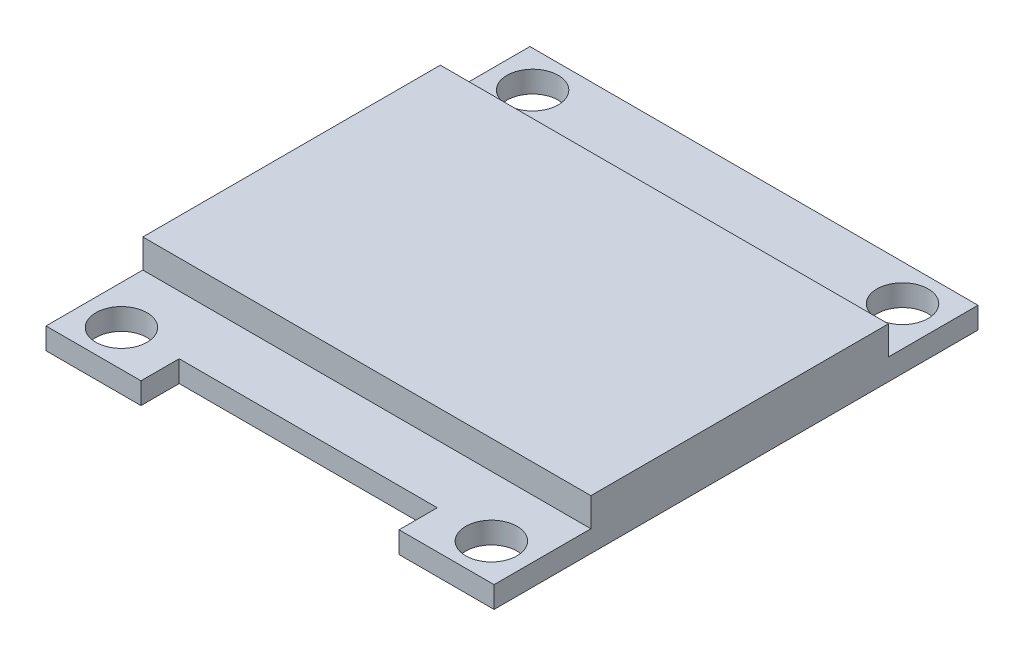
ISO-10303-21;
HEADER;
FILE_DESCRIPTION(('STEP AP214'),'2;1');
FILE_NAME('part.step','',(''),(''),'','','');
FILE_SCHEMA(('AUTOMOTIVE_DESIGN { 1 0 10303 214 1 1 1 1 }'));
ENDSEC;
DATA;
#1=APPLICATION_CONTEXT('core data for automotive mechanical design processes');
#2=APPLICATION_PROTOCOL_DEFINITION('international standard','automotive_design',2000,#1);
#3=PRODUCT_CONTEXT('',#1,'mechanical');
#4=PRODUCT('Part','Part','',(#3));
#5=PRODUCT_RELATED_PRODUCT_CATEGORY('part','',(#4));
#6=PRODUCT_DEFINITION_FORMATION('','',#4);
#7=PRODUCT_DEFINITION_CONTEXT('part definition',#1,'design');
#8=PRODUCT_DEFINITION('design','',#6,#7);
#9=PRODUCT_DEFINITION_SHAPE('','',#8);
#10=(LENGTH_UNIT() NAMED_UNIT(*) SI_UNIT(.MILLI.,.METRE.));
#11=(NAMED_UNIT(*) PLANE_ANGLE_UNIT() SI_UNIT($,.RADIAN.));
#12=(NAMED_UNIT(*) SI_UNIT($,.STERADIAN.) SOLID_ANGLE_UNIT());
#13=UNCERTAINTY_MEASURE_WITH_UNIT(LENGTH_MEASURE(1.E-05),#10,'distance_accuracy_value','');
#14=(GEOMETRIC_REPRESENTATION_CONTEXT(3) GLOBAL_UNCERTAINTY_ASSIGNED_CONTEXT((#13)) GLOBAL_UNIT_ASSIGNED_CONTEXT((#10,
#11,#12)) REPRESENTATION_CONTEXT('',''));
#15=CARTESIAN_POINT('',(0.,0.,0.));
#16=DIRECTION('',(0.,0.,1.));
#17=DIRECTION('',(1.,0.,0.));
#18=AXIS2_PLACEMENT_3D('',#15,#16,#17);
#19=CARTESIAN_POINT('',(-12.5,1.2,13.5));
#20=DIRECTION('',(0.,0.,-1.));
#21=DIRECTION('',(-1.,0.,0.));
#22=AXIS2_PLACEMENT_3D('',#19,#20,#21);
#23=PLANE('',#22);
#24=DIRECTION('',(1.,0.,0.));
#25=VECTOR('',#24,1.);
#26=CARTESIAN_POINT('',(-12.5,1.2,13.5));
#27=LINE('',#26,#25);
#28=CARTESIAN_POINT('',(7.2,1.2,13.5));
#29=VERTEX_POINT('',#28);
#30=CARTESIAN_POINT('',(12.5,1.2,13.5));
#31=VERTEX_POINT('',#30);
#32=EDGE_CURVE('E142',#29,#31,#27,.T.);
#33=ORIENTED_EDGE('',*,*,#32,.F.);
#34=DIRECTION('',(0.,1.,0.));
#35=VECTOR('',#34,1.);
#36=CARTESIAN_POINT('',(7.2,-14.5566788794697,13.5));
#37=LINE('',#36,#35);
#38=CARTESIAN_POINT('',(7.2,0.,13.5));
#39=VERTEX_POINT('',#38);
#40=EDGE_CURVE('E130',#39,#29,#37,.T.);
#41=ORIENTED_EDGE('',*,*,#40,.F.);
#42=DIRECTION('',(1.,0.,0.));
#43=VECTOR('',#42,1.);
#44=CARTESIAN_POINT('',(-12.5,0.,13.5));
#45=LINE('',#44,#43);
#46=CARTESIAN_POINT('',(12.5,0.,13.5));
#47=VERTEX_POINT('',#46);
#48=EDGE_CURVE('E140',#39,#47,#45,.T.);
#49=ORIENTED_EDGE('',*,*,#48,.T.);
#50=DIRECTION('',(0.,-1.,0.));
#51=VECTOR('',#50,1.);
#52=CARTESIAN_POINT('',(12.5,1.2,13.5));
#53=LINE('',#52,#51);
#54=EDGE_CURVE('E159',#31,#47,#53,.T.);
#55=ORIENTED_EDGE('',*,*,#54,.F.);
#56=EDGE_LOOP('',(#33,#41,#49,#55));
#57=FACE_BOUND('',#56,.T.);
#58=ADVANCED_FACE('F37',(#57),#23,.F.);
#59=CARTESIAN_POINT('',(0.,1.2,0.));
#60=DIRECTION('',(0.,-1.,0.));
#61=DIRECTION('',(0.,0.,-1.));
#62=AXIS2_PLACEMENT_3D('',#59,#60,#61);
#63=PLANE('',#62);
#64=CARTESIAN_POINT('',(10.32,1.2,11.47));
#65=DIRECTION('',(0.,1.,0.));
#66=DIRECTION('',(0.,0.,1.));
#67=AXIS2_PLACEMENT_3D('',#64,#65,#66);
#68=CIRCLE('',#67,1.43);
#69=CARTESIAN_POINT('',(10.32,1.2,12.9));
#70=VERTEX_POINT('',#69);
#71=EDGE_CURVE('E232',#70,#70,#68,.T.);
#72=ORIENTED_EDGE('',*,*,#71,.F.);
#73=EDGE_LOOP('',(#72));
#74=FACE_BOUND('',#73,.T.);
#75=CARTESIAN_POINT('',(-10.32,1.2,11.47));
#76=DIRECTION('',(0.,1.,0.));
#77=DIRECTION('',(0.,0.,1.));
#78=AXIS2_PLACEMENT_3D('',#75,#76,#77);
#79=CIRCLE('',#78,1.43);
#80=CARTESIAN_POINT('',(-10.32,1.2,12.9));
#81=VERTEX_POINT('',#80);
#82=EDGE_CURVE('E420',#81,#81,#79,.T.);
#83=ORIENTED_EDGE('',*,*,#82,.F.);
#84=EDGE_LOOP('',(#83));
#85=FACE_BOUND('',#84,.T.);
#86=DIRECTION('',(-1.,0.,0.));
#87=VECTOR('',#86,1.);
#88=CARTESIAN_POINT('',(-7.2,1.2,11.37));
#89=LINE('',#88,#87);
#90=CARTESIAN_POINT('',(7.2,1.2,11.37));
#91=VERTEX_POINT('',#90);
#92=CARTESIAN_POINT('',(-7.2,1.2,11.37));
#93=VERTEX_POINT('',#92);
#94=EDGE_CURVE('E143',#91,#93,#89,.T.);
#95=ORIENTED_EDGE('',*,*,#94,.F.);
#96=DIRECTION('',(0.,0.,-1.));
#97=VECTOR('',#96,1.);
#98=CARTESIAN_POINT('',(7.2,1.2,13.5));
#99=LINE('',#98,#97);
#100=EDGE_CURVE('E216',#29,#91,#99,.T.);
#101=ORIENTED_EDGE('',*,*,#100,.F.);
#102=ORIENTED_EDGE('',*,*,#32,.T.);
#103=DIRECTION('',(0.,0.,-1.));
#104=VECTOR('',#103,1.);
#105=CARTESIAN_POINT('',(12.5,1.2,13.5));
#106=LINE('',#105,#104);
#107=CARTESIAN_POINT('',(12.5,1.2,8.1));
#108=VERTEX_POINT('',#107);
#109=EDGE_CURVE('E204',#31,#108,#106,.T.);
#110=ORIENTED_EDGE('',*,*,#109,.T.);
#111=DIRECTION('',(1.,0.,0.));
#112=VECTOR('',#111,1.);
#113=CARTESIAN_POINT('',(12.5,1.2,8.1));
#114=LINE('',#113,#112);
#115=CARTESIAN_POINT('',(-12.5,1.2,8.1));
#116=VERTEX_POINT('',#115);
#117=EDGE_CURVE('E60',#116,#108,#114,.T.);
#118=ORIENTED_EDGE('',*,*,#117,.F.);
#119=DIRECTION('',(0.,0.,1.));
#120=VECTOR('',#119,1.);
#121=CARTESIAN_POINT('',(-12.5,1.2,13.5));
#122=LINE('',#121,#120);
#123=CARTESIAN_POINT('',(-12.5,1.2,13.5));
#124=VERTEX_POINT('',#123);
#125=EDGE_CURVE('E182',#116,#124,#122,.T.);
#126=ORIENTED_EDGE('',*,*,#125,.T.);
#127=CARTESIAN_POINT('',(-7.2,1.2,13.5));
#128=VERTEX_POINT('',#127);
#129=EDGE_CURVE('E162',#124,#128,#27,.T.);
#130=ORIENTED_EDGE('',*,*,#129,.T.);
#131=DIRECTION('',(0.,0.,1.));
#132=VECTOR('',#131,1.);
#133=CARTESIAN_POINT('',(-7.2,1.2,13.5));
#134=LINE('',#133,#132);
#135=EDGE_CURVE('E219',#93,#128,#134,.T.);
#136=ORIENTED_EDGE('',*,*,#135,.F.);
#137=EDGE_LOOP('',(#95,#101,#102,#110,#118,#126,#130,#136));
#138=FACE_BOUND('',#137,.T.);
#139=ADVANCED_FACE('F215',(#74,#85,#138),#63,.F.);
#140=CARTESIAN_POINT('',(-10.32,1.2,-11.47));
#141=DIRECTION('',(0.,1.,0.));
#142=DIRECTION('',(0.,0.,1.));
#143=AXIS2_PLACEMENT_3D('',#140,#141,#142);
#144=CIRCLE('',#143,1.43);
#145=CARTESIAN_POINT('',(-10.32,1.2,-10.04));
#146=VERTEX_POINT('',#145);
#147=EDGE_CURVE('E427',#146,#146,#144,.T.);
#148=ORIENTED_EDGE('',*,*,#147,.F.);
#149=EDGE_LOOP('',(#148));
#150=FACE_BOUND('',#149,.T.);
#151=CARTESIAN_POINT('',(10.32,1.2,-11.47));
#152=DIRECTION('',(0.,1.,0.));
#153=DIRECTION('',(0.,0.,1.));
#154=AXIS2_PLACEMENT_3D('',#151,#152,#153);
#155=CIRCLE('',#154,1.43);
#156=CARTESIAN_POINT('',(10.32,1.2,-10.04));
#157=VERTEX_POINT('',#156);
#158=EDGE_CURVE('E233',#157,#157,#155,.T.);
#159=ORIENTED_EDGE('',*,*,#158,.F.);
#160=EDGE_LOOP('',(#159));
#161=FACE_BOUND('',#160,.T.);
#162=DIRECTION('',(-1.,0.,0.));
#163=VECTOR('',#162,1.);
#164=CARTESIAN_POINT('',(12.5,1.2,-8.5));
#165=LINE('',#164,#163);
#166=CARTESIAN_POINT('',(12.5,1.2,-8.5));
#167=VERTEX_POINT('',#166);
#168=CARTESIAN_POINT('',(-12.5,1.2,-8.5));
#169=VERTEX_POINT('',#168);
#170=EDGE_CURVE('E240',#167,#169,#165,.T.);
#171=ORIENTED_EDGE('',*,*,#170,.F.);
#172=CARTESIAN_POINT('',(12.5,1.2,-13.5));
#173=VERTEX_POINT('',#172);
#174=EDGE_CURVE('E154',#167,#173,#106,.T.);
#175=ORIENTED_EDGE('',*,*,#174,.T.);
#176=DIRECTION('',(-1.,0.,0.));
#177=VECTOR('',#176,1.);
#178=CARTESIAN_POINT('',(-12.5,1.2,-13.5));
#179=LINE('',#178,#177);
#180=CARTESIAN_POINT('',(-12.5,1.2,-13.5));
#181=VERTEX_POINT('',#180);
#182=EDGE_CURVE('E187',#173,#181,#179,.T.);
#183=ORIENTED_EDGE('',*,*,#182,.T.);
#184=EDGE_CURVE('E172',#181,#169,#122,.T.);
#185=ORIENTED_EDGE('',*,*,#184,.T.);
#186=EDGE_LOOP('',(#171,#175,#183,#185));
#187=FACE_BOUND('',#186,.T.);
#188=ADVANCED_FACE('F257',(#150,#161,#187),#63,.F.);
#189=CARTESIAN_POINT('',(12.5,1.2,13.5));
#190=DIRECTION('',(-1.,0.,0.));
#191=DIRECTION('',(0.,0.,1.));
#192=AXIS2_PLACEMENT_3D('',#189,#190,#191);
#193=PLANE('',#192);
#194=DIRECTION('',(0.,0.,-1.));
#195=VECTOR('',#194,1.);
#196=CARTESIAN_POINT('',(12.5,0.,13.5));
#197=LINE('',#196,#195);
#198=CARTESIAN_POINT('',(12.5,0.,-13.5));
#199=VERTEX_POINT('',#198);
#200=EDGE_CURVE('E149',#47,#199,#197,.T.);
#201=ORIENTED_EDGE('',*,*,#200,.T.);
#202=DIRECTION('',(0.,-1.,0.));
#203=VECTOR('',#202,1.);
#204=CARTESIAN_POINT('',(12.5,1.2,-13.5));
#205=LINE('',#204,#203);
#206=EDGE_CURVE('E11',#173,#199,#205,.T.);
#207=ORIENTED_EDGE('',*,*,#206,.F.);
#208=ORIENTED_EDGE('',*,*,#174,.F.);
#209=DIRECTION('',(0.,-1.,0.));
#210=VECTOR('',#209,1.);
#211=CARTESIAN_POINT('',(12.5,2.8,-8.5));
#212=LINE('',#211,#210);
#213=CARTESIAN_POINT('',(12.5,2.8,-8.5));
#214=VERTEX_POINT('',#213);
#215=EDGE_CURVE('E197',#214,#167,#212,.T.);
#216=ORIENTED_EDGE('',*,*,#215,.F.);
#217=DIRECTION('',(0.,0.,-1.));
#218=VECTOR('',#217,1.);
#219=CARTESIAN_POINT('',(12.5,2.8,-8.5));
#220=LINE('',#219,#218);
#221=CARTESIAN_POINT('',(12.5,2.8,8.1));
#222=VERTEX_POINT('',#221);
#223=EDGE_CURVE('E241',#222,#214,#220,.T.);
#224=ORIENTED_EDGE('',*,*,#223,.F.);
#225=DIRECTION('',(0.,-1.,0.));
#226=VECTOR('',#225,1.);
#227=CARTESIAN_POINT('',(12.5,2.8,8.1));
#228=LINE('',#227,#226);
#229=EDGE_CURVE('E195',#222,#108,#228,.T.);
#230=ORIENTED_EDGE('',*,*,#229,.T.);
#231=ORIENTED_EDGE('',*,*,#109,.F.);
#232=ORIENTED_EDGE('',*,*,#54,.T.);
#233=EDGE_LOOP('',(#201,#207,#208,#216,#224,#230,#231,#232));
#234=FACE_BOUND('',#233,.T.);
#235=ADVANCED_FACE('F39',(#234),#193,.F.);
#236=CARTESIAN_POINT('',(-12.5,1.2,-13.5));
#237=DIRECTION('',(0.,0.,1.));
#238=DIRECTION('',(1.,0.,0.));
#239=AXIS2_PLACEMENT_3D('',#236,#237,#238);
#240=PLANE('',#239);
#241=DIRECTION('',(-1.,0.,0.));
#242=VECTOR('',#241,1.);
#243=CARTESIAN_POINT('',(-12.5,0.,-13.5));
#244=LINE('',#243,#242);
#245=CARTESIAN_POINT('',(-12.5,0.,-13.5));
#246=VERTEX_POINT('',#245);
#247=EDGE_CURVE('E155',#199,#246,#244,.T.);
#248=ORIENTED_EDGE('',*,*,#247,.T.);
#249=DIRECTION('',(0.,-1.,0.));
#250=VECTOR('',#249,1.);
#251=CARTESIAN_POINT('',(-12.5,1.2,-13.5));
#252=LINE('',#251,#250);
#253=EDGE_CURVE('E45',#181,#246,#252,.T.);
#254=ORIENTED_EDGE('',*,*,#253,.F.);
#255=ORIENTED_EDGE('',*,*,#182,.F.);
#256=ORIENTED_EDGE('',*,*,#206,.T.);
#257=EDGE_LOOP('',(#248,#254,#255,#256));
#258=FACE_BOUND('',#257,.T.);
#259=ADVANCED_FACE('F208',(#258),#240,.F.);
#260=CARTESIAN_POINT('',(-12.5,1.2,13.5));
#261=DIRECTION('',(1.,0.,0.));
#262=DIRECTION('',(0.,0.,-1.));
#263=AXIS2_PLACEMENT_3D('',#260,#261,#262);
#264=PLANE('',#263);
#265=DIRECTION('',(0.,0.,1.));
#266=VECTOR('',#265,1.);
#267=CARTESIAN_POINT('',(-12.5,0.,13.5));
#268=LINE('',#267,#266);
#269=CARTESIAN_POINT('',(-12.5,0.,13.5));
#270=VERTEX_POINT('',#269);
#271=EDGE_CURVE('E151',#246,#270,#268,.T.);
#272=ORIENTED_EDGE('',*,*,#271,.T.);
#273=DIRECTION('',(0.,-1.,0.));
#274=VECTOR('',#273,1.);
#275=CARTESIAN_POINT('',(-12.5,1.2,13.5));
#276=LINE('',#275,#274);
#277=EDGE_CURVE('E161',#124,#270,#276,.T.);
#278=ORIENTED_EDGE('',*,*,#277,.F.);
#279=ORIENTED_EDGE('',*,*,#125,.F.);
#280=DIRECTION('',(0.,-1.,0.));
#281=VECTOR('',#280,1.);
#282=CARTESIAN_POINT('',(-12.5,2.8,8.1));
#283=LINE('',#282,#281);
#284=CARTESIAN_POINT('',(-12.5,2.8,8.1));
#285=VERTEX_POINT('',#284);
#286=EDGE_CURVE('E185',#285,#116,#283,.T.);
#287=ORIENTED_EDGE('',*,*,#286,.F.);
#288=DIRECTION('',(0.,0.,1.));
#289=VECTOR('',#288,1.);
#290=CARTESIAN_POINT('',(-12.5,2.8,-8.5));
#291=LINE('',#290,#289);
#292=CARTESIAN_POINT('',(-12.5,2.8,-8.5));
#293=VERTEX_POINT('',#292);
#294=EDGE_CURVE('E246',#293,#285,#291,.T.);
#295=ORIENTED_EDGE('',*,*,#294,.F.);
#296=DIRECTION('',(0.,-1.,0.));
#297=VECTOR('',#296,1.);
#298=CARTESIAN_POINT('',(-12.5,2.8,-8.5));
#299=LINE('',#298,#297);
#300=EDGE_CURVE('E194',#293,#169,#299,.T.);
#301=ORIENTED_EDGE('',*,*,#300,.T.);
#302=ORIENTED_EDGE('',*,*,#184,.F.);
#303=ORIENTED_EDGE('',*,*,#253,.T.);
#304=EDGE_LOOP('',(#272,#278,#279,#287,#295,#301,#302,#303));
#305=FACE_BOUND('',#304,.T.);
#306=ADVANCED_FACE('F169',(#305),#264,.F.);
#307=CARTESIAN_POINT('',(-7.2,0.,13.5));
#308=VERTEX_POINT('',#307);
#309=EDGE_CURVE('E150',#270,#308,#45,.T.);
#310=ORIENTED_EDGE('',*,*,#309,.T.);
#311=DIRECTION('',(0.,1.,0.));
#312=VECTOR('',#311,1.);
#313=CARTESIAN_POINT('',(-7.2,-14.5566788794697,13.5));
#314=LINE('',#313,#312);
#315=EDGE_CURVE('E52',#308,#128,#314,.T.);
#316=ORIENTED_EDGE('',*,*,#315,.T.);
#317=ORIENTED_EDGE('',*,*,#129,.F.);
#318=ORIENTED_EDGE('',*,*,#277,.T.);
#319=EDGE_LOOP('',(#310,#316,#317,#318));
#320=FACE_BOUND('',#319,.T.);
#321=ADVANCED_FACE('F178',(#320),#23,.F.);
#322=CARTESIAN_POINT('',(0.,0.,0.));
#323=DIRECTION('',(0.,-1.,0.));
#324=DIRECTION('',(0.,0.,-1.));
#325=AXIS2_PLACEMENT_3D('',#322,#323,#324);
#326=PLANE('',#325);
#327=DIRECTION('',(0.,0.,-1.));
#328=VECTOR('',#327,1.);
#329=CARTESIAN_POINT('',(7.2,0.,13.5));
#330=LINE('',#329,#328);
#331=CARTESIAN_POINT('',(7.2,0.,11.37));
#332=VERTEX_POINT('',#331);
#333=EDGE_CURVE('E126',#39,#332,#330,.T.);
#334=ORIENTED_EDGE('',*,*,#333,.T.);
#335=DIRECTION('',(-1.,0.,0.));
#336=VECTOR('',#335,1.);
#337=CARTESIAN_POINT('',(-7.2,0.,11.37));
#338=LINE('',#337,#336);
#339=CARTESIAN_POINT('',(-7.2,0.,11.37));
#340=VERTEX_POINT('',#339);
#341=EDGE_CURVE('E227',#332,#340,#338,.T.);
#342=ORIENTED_EDGE('',*,*,#341,.T.);
#343=DIRECTION('',(0.,0.,1.));
#344=VECTOR('',#343,1.);
#345=CARTESIAN_POINT('',(-7.2,0.,13.5));
#346=LINE('',#345,#344);
#347=EDGE_CURVE('E176',#340,#308,#346,.T.);
#348=ORIENTED_EDGE('',*,*,#347,.T.);
#349=ORIENTED_EDGE('',*,*,#309,.F.);
#350=ORIENTED_EDGE('',*,*,#271,.F.);
#351=ORIENTED_EDGE('',*,*,#247,.F.);
#352=ORIENTED_EDGE('',*,*,#200,.F.);
#353=ORIENTED_EDGE('',*,*,#48,.F.);
#354=EDGE_LOOP('',(#334,#342,#348,#349,#350,#351,#352,#353));
#355=FACE_BOUND('',#354,.T.);
#356=CARTESIAN_POINT('',(10.32,0.,11.47));
#357=DIRECTION('',(0.,-1.,0.));
#358=DIRECTION('',(0.,0.,-1.));
#359=AXIS2_PLACEMENT_3D('',#356,#357,#358);
#360=CIRCLE('',#359,1.43);
#361=CARTESIAN_POINT('',(10.32,0.,10.04));
#362=VERTEX_POINT('',#361);
#363=EDGE_CURVE('E419',#362,#362,#360,.F.);
#364=ORIENTED_EDGE('',*,*,#363,.T.);
#365=EDGE_LOOP('',(#364));
#366=FACE_BOUND('',#365,.T.);
#367=CARTESIAN_POINT('',(-10.32,0.,11.47));
#368=DIRECTION('',(0.,-1.,0.));
#369=DIRECTION('',(0.,0.,-1.));
#370=AXIS2_PLACEMENT_3D('',#367,#368,#369);
#371=CIRCLE('',#370,1.43);
#372=CARTESIAN_POINT('',(-10.32,0.,10.04));
#373=VERTEX_POINT('',#372);
#374=EDGE_CURVE('E422',#373,#373,#371,.F.);
#375=ORIENTED_EDGE('',*,*,#374,.T.);
#376=EDGE_LOOP('',(#375));
#377=FACE_BOUND('',#376,.T.);
#378=CARTESIAN_POINT('',(-10.32,0.,-11.47));
#379=DIRECTION('',(0.,-1.,0.));
#380=DIRECTION('',(0.,0.,-1.));
#381=AXIS2_PLACEMENT_3D('',#378,#379,#380);
#382=CIRCLE('',#381,1.43);
#383=CARTESIAN_POINT('',(-10.32,0.,-12.9));
#384=VERTEX_POINT('',#383);
#385=EDGE_CURVE('E237',#384,#384,#382,.F.);
#386=ORIENTED_EDGE('',*,*,#385,.T.);
#387=EDGE_LOOP('',(#386));
#388=FACE_BOUND('',#387,.T.);
#389=CARTESIAN_POINT('',(10.32,0.,-11.47));
#390=DIRECTION('',(0.,-1.,0.));
#391=DIRECTION('',(0.,0.,-1.));
#392=AXIS2_PLACEMENT_3D('',#389,#390,#391);
#393=CIRCLE('',#392,1.43);
#394=CARTESIAN_POINT('',(10.32,0.,-12.9));
#395=VERTEX_POINT('',#394);
#396=EDGE_CURVE('E236',#395,#395,#393,.F.);
#397=ORIENTED_EDGE('',*,*,#396,.T.);
#398=EDGE_LOOP('',(#397));
#399=FACE_BOUND('',#398,.T.);
#400=ADVANCED_FACE('F146',(#355,#366,#377,#388,#399),#326,.T.);
#401=CARTESIAN_POINT('',(12.5,2.8,-8.5));
#402=DIRECTION('',(0.,0.,1.));
#403=DIRECTION('',(1.,0.,0.));
#404=AXIS2_PLACEMENT_3D('',#401,#402,#403);
#405=PLANE('',#404);
#406=ORIENTED_EDGE('',*,*,#170,.T.);
#407=ORIENTED_EDGE('',*,*,#300,.F.);
#408=DIRECTION('',(-1.,0.,0.));
#409=VECTOR('',#408,1.);
#410=CARTESIAN_POINT('',(12.5,2.8,-8.5));
#411=LINE('',#410,#409);
#412=EDGE_CURVE('E244',#214,#293,#411,.T.);
#413=ORIENTED_EDGE('',*,*,#412,.F.);
#414=ORIENTED_EDGE('',*,*,#215,.T.);
#415=EDGE_LOOP('',(#406,#407,#413,#414));
#416=FACE_BOUND('',#415,.T.);
#417=ADVANCED_FACE('F252',(#416),#405,.F.);
#418=CARTESIAN_POINT('',(12.5,2.8,8.1));
#419=DIRECTION('',(0.,0.,-1.));
#420=DIRECTION('',(-1.,0.,0.));
#421=AXIS2_PLACEMENT_3D('',#418,#419,#420);
#422=PLANE('',#421);
#423=ORIENTED_EDGE('',*,*,#117,.T.);
#424=ORIENTED_EDGE('',*,*,#229,.F.);
#425=DIRECTION('',(1.,0.,0.));
#426=VECTOR('',#425,1.);
#427=CARTESIAN_POINT('',(12.5,2.8,8.1));
#428=LINE('',#427,#426);
#429=EDGE_CURVE('E193',#285,#222,#428,.T.);
#430=ORIENTED_EDGE('',*,*,#429,.F.);
#431=ORIENTED_EDGE('',*,*,#286,.T.);
#432=EDGE_LOOP('',(#423,#424,#430,#431));
#433=FACE_BOUND('',#432,.T.);
#434=ADVANCED_FACE('F190',(#433),#422,.F.);
#435=CARTESIAN_POINT('',(0.,2.8,0.));
#436=DIRECTION('',(0.,-1.,0.));
#437=DIRECTION('',(0.,0.,-1.));
#438=AXIS2_PLACEMENT_3D('',#435,#436,#437);
#439=PLANE('',#438);
#440=ORIENTED_EDGE('',*,*,#223,.T.);
#441=ORIENTED_EDGE('',*,*,#412,.T.);
#442=ORIENTED_EDGE('',*,*,#294,.T.);
#443=ORIENTED_EDGE('',*,*,#429,.T.);
#444=EDGE_LOOP('',(#440,#441,#442,#443));
#445=FACE_BOUND('',#444,.T.);
#446=ADVANCED_FACE('F256',(#445),#439,.F.);
#447=CARTESIAN_POINT('',(10.32,-14.5566788794697,-11.47));
#448=DIRECTION('',(0.,1.,0.));
#449=DIRECTION('',(0.,0.,1.));
#450=AXIS2_PLACEMENT_3D('',#447,#448,#449);
#451=CYLINDRICAL_SURFACE('',#450,1.43);
#452=ORIENTED_EDGE('',*,*,#158,.T.);
#453=EDGE_LOOP('',(#452));
#454=FACE_BOUND('',#453,.T.);
#455=ORIENTED_EDGE('',*,*,#396,.F.);
#456=EDGE_LOOP('',(#455));
#457=FACE_BOUND('',#456,.T.);
#458=ADVANCED_FACE('F319',(#454,#457),#451,.F.);
#459=CARTESIAN_POINT('',(-10.32,-14.5566788794697,-11.47));
#460=DIRECTION('',(0.,1.,0.));
#461=DIRECTION('',(0.,0.,1.));
#462=AXIS2_PLACEMENT_3D('',#459,#460,#461);
#463=CYLINDRICAL_SURFACE('',#462,1.43);
#464=ORIENTED_EDGE('',*,*,#147,.T.);
#465=EDGE_LOOP('',(#464));
#466=FACE_BOUND('',#465,.T.);
#467=ORIENTED_EDGE('',*,*,#385,.F.);
#468=EDGE_LOOP('',(#467));
#469=FACE_BOUND('',#468,.T.);
#470=ADVANCED_FACE('F352',(#466,#469),#463,.F.);
#471=CARTESIAN_POINT('',(-10.32,-14.5566788794697,11.47));
#472=DIRECTION('',(0.,1.,0.));
#473=DIRECTION('',(0.,0.,1.));
#474=AXIS2_PLACEMENT_3D('',#471,#472,#473);
#475=CYLINDRICAL_SURFACE('',#474,1.43);
#476=ORIENTED_EDGE('',*,*,#82,.T.);
#477=EDGE_LOOP('',(#476));
#478=FACE_BOUND('',#477,.T.);
#479=ORIENTED_EDGE('',*,*,#374,.F.);
#480=EDGE_LOOP('',(#479));
#481=FACE_BOUND('',#480,.T.);
#482=ADVANCED_FACE('F362',(#478,#481),#475,.F.);
#483=CARTESIAN_POINT('',(10.32,-14.5566788794697,11.47));
#484=DIRECTION('',(0.,1.,0.));
#485=DIRECTION('',(0.,0.,1.));
#486=AXIS2_PLACEMENT_3D('',#483,#484,#485);
#487=CYLINDRICAL_SURFACE('',#486,1.43);
#488=ORIENTED_EDGE('',*,*,#71,.T.);
#489=EDGE_LOOP('',(#488));
#490=FACE_BOUND('',#489,.T.);
#491=ORIENTED_EDGE('',*,*,#363,.F.);
#492=EDGE_LOOP('',(#491));
#493=FACE_BOUND('',#492,.T.);
#494=ADVANCED_FACE('F372',(#490,#493),#487,.F.);
#495=CARTESIAN_POINT('',(7.2,-14.5566788794697,13.5));
#496=DIRECTION('',(1.,0.,0.));
#497=DIRECTION('',(0.,0.,-1.));
#498=AXIS2_PLACEMENT_3D('',#495,#496,#497);
#499=PLANE('',#498);
#500=ORIENTED_EDGE('',*,*,#40,.T.);
#501=ORIENTED_EDGE('',*,*,#100,.T.);
#502=DIRECTION('',(0.,1.,0.));
#503=VECTOR('',#502,1.);
#504=CARTESIAN_POINT('',(7.2,-14.5566788794697,11.37));
#505=LINE('',#504,#503);
#506=EDGE_CURVE('E132',#332,#91,#505,.T.);
#507=ORIENTED_EDGE('',*,*,#506,.F.);
#508=ORIENTED_EDGE('',*,*,#333,.F.);
#509=EDGE_LOOP('',(#500,#501,#507,#508));
#510=FACE_BOUND('',#509,.T.);
#511=ADVANCED_FACE('F128',(#510),#499,.F.);
#512=CARTESIAN_POINT('',(-7.2,-14.5566788794697,11.37));
#513=DIRECTION('',(0.,0.,-1.));
#514=DIRECTION('',(-1.,0.,0.));
#515=AXIS2_PLACEMENT_3D('',#512,#513,#514);
#516=PLANE('',#515);
#517=ORIENTED_EDGE('',*,*,#506,.T.);
#518=ORIENTED_EDGE('',*,*,#94,.T.);
#519=DIRECTION('',(0.,1.,0.));
#520=VECTOR('',#519,1.);
#521=CARTESIAN_POINT('',(-7.2,-14.5566788794697,11.37));
#522=LINE('',#521,#520);
#523=EDGE_CURVE('E226',#340,#93,#522,.T.);
#524=ORIENTED_EDGE('',*,*,#523,.F.);
#525=ORIENTED_EDGE('',*,*,#341,.F.);
#526=EDGE_LOOP('',(#517,#518,#524,#525));
#527=FACE_BOUND('',#526,.T.);
#528=ADVANCED_FACE('F391',(#527),#516,.F.);
#529=CARTESIAN_POINT('',(-7.2,-14.5566788794697,13.5));
#530=DIRECTION('',(-1.,0.,0.));
#531=DIRECTION('',(0.,0.,1.));
#532=AXIS2_PLACEMENT_3D('',#529,#530,#531);
#533=PLANE('',#532);
#534=ORIENTED_EDGE('',*,*,#523,.T.);
#535=ORIENTED_EDGE('',*,*,#135,.T.);
#536=ORIENTED_EDGE('',*,*,#315,.F.);
#537=ORIENTED_EDGE('',*,*,#347,.F.);
#538=EDGE_LOOP('',(#534,#535,#536,#537));
#539=FACE_BOUND('',#538,.T.);
#540=ADVANCED_FACE('F400',(#539),#533,.F.);
#541=CLOSED_SHELL('',(#58,#139,#188,#235,#259,#306,#321,#400,#417,#434,#446,#458,#470,#482,#494,
#511,#528,#540));
#542=MANIFOLD_SOLID_BREP('B2',#541);
#543=ADVANCED_BREP_SHAPE_REPRESENTATION('',(#18,#542),#14);
#544=SHAPE_DEFINITION_REPRESENTATION(#9,#543);
ENDSEC;
END-ISO-10303-21;
